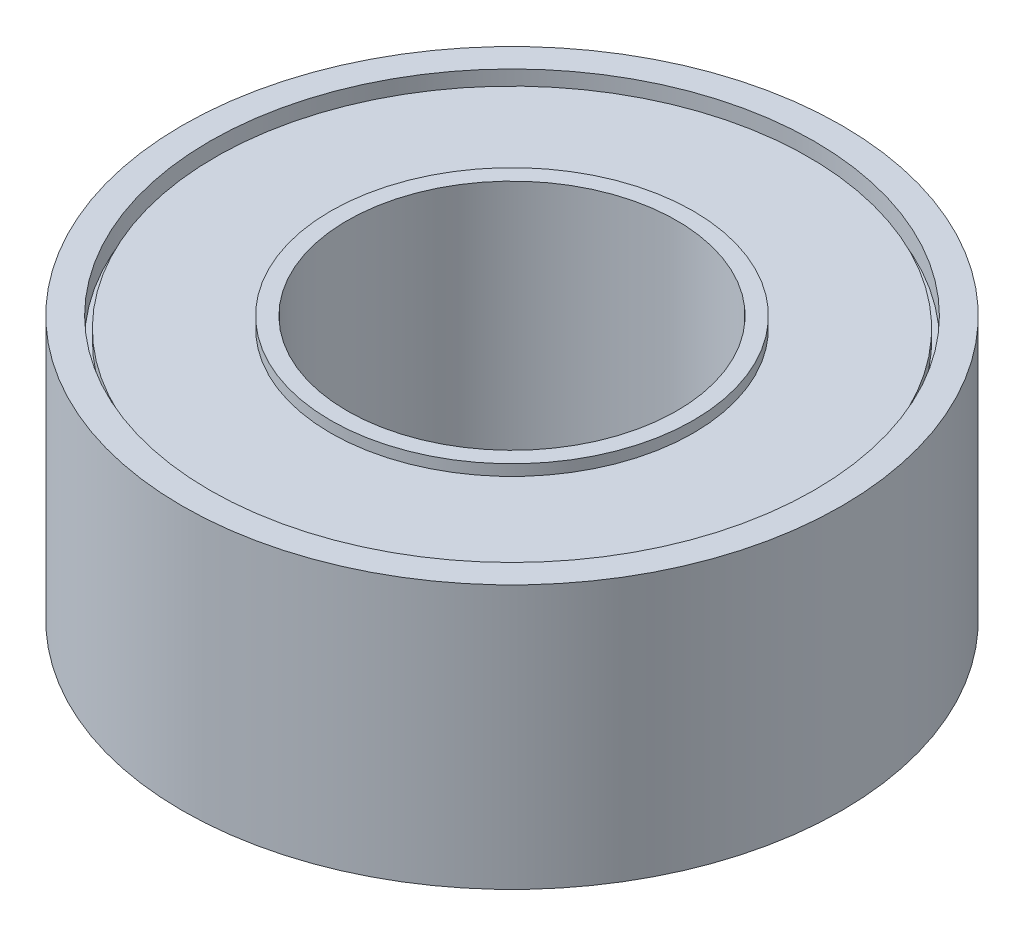
ISO-10303-21;
HEADER;
FILE_DESCRIPTION(('STEP AP214'),'2;1');
FILE_NAME('part.step','',(''),(''),'','','');
FILE_SCHEMA(('AUTOMOTIVE_DESIGN { 1 0 10303 214 1 1 1 1 }'));
ENDSEC;
DATA;
#1=APPLICATION_CONTEXT('core data for automotive mechanical design processes');
#2=APPLICATION_PROTOCOL_DEFINITION('international standard','automotive_design',2000,#1);
#3=PRODUCT_CONTEXT('',#1,'mechanical');
#4=PRODUCT('Part','Part','',(#3));
#5=PRODUCT_RELATED_PRODUCT_CATEGORY('part','',(#4));
#6=PRODUCT_DEFINITION_FORMATION('','',#4);
#7=PRODUCT_DEFINITION_CONTEXT('part definition',#1,'design');
#8=PRODUCT_DEFINITION('design','',#6,#7);
#9=PRODUCT_DEFINITION_SHAPE('','',#8);
#10=(LENGTH_UNIT() NAMED_UNIT(*) SI_UNIT(.MILLI.,.METRE.));
#11=(NAMED_UNIT(*) PLANE_ANGLE_UNIT() SI_UNIT($,.RADIAN.));
#12=(NAMED_UNIT(*) SI_UNIT($,.STERADIAN.) SOLID_ANGLE_UNIT());
#13=UNCERTAINTY_MEASURE_WITH_UNIT(LENGTH_MEASURE(1.E-05),#10,'distance_accuracy_value','');
#14=(GEOMETRIC_REPRESENTATION_CONTEXT(3) GLOBAL_UNCERTAINTY_ASSIGNED_CONTEXT((#13)) GLOBAL_UNIT_ASSIGNED_CONTEXT((#10,
#11,#12)) REPRESENTATION_CONTEXT('',''));
#15=CARTESIAN_POINT('',(0.,0.,0.));
#16=DIRECTION('',(0.,0.,1.));
#17=DIRECTION('',(1.,0.,0.));
#18=AXIS2_PLACEMENT_3D('',#15,#16,#17);
#19=CARTESIAN_POINT('',(0.,2.3,0.));
#20=DIRECTION('',(0.,1.,0.));
#21=DIRECTION('',(0.,0.,1.));
#22=AXIS2_PLACEMENT_3D('',#19,#20,#21);
#23=PLANE('',#22);
#24=CARTESIAN_POINT('',(0.,2.3,0.));
#25=DIRECTION('',(0.,1.,0.));
#26=DIRECTION('',(0.,0.,1.));
#27=AXIS2_PLACEMENT_3D('',#24,#25,#26);
#28=CIRCLE('',#27,1.65);
#29=CARTESIAN_POINT('',(0.,2.3,1.65));
#30=VERTEX_POINT('',#29);
#31=EDGE_CURVE('E53',#30,#30,#28,.T.);
#32=ORIENTED_EDGE('',*,*,#31,.F.);
#33=EDGE_LOOP('',(#32));
#34=FACE_BOUND('',#33,.T.);
#35=CARTESIAN_POINT('',(0.,2.3,0.));
#36=DIRECTION('',(0.,1.,0.));
#37=DIRECTION('',(0.,0.,1.));
#38=AXIS2_PLACEMENT_3D('',#35,#36,#37);
#39=CIRCLE('',#38,2.7);
#40=CARTESIAN_POINT('',(0.,2.3,2.7));
#41=VERTEX_POINT('',#40);
#42=EDGE_CURVE('E81',#41,#41,#39,.T.);
#43=ORIENTED_EDGE('',*,*,#42,.T.);
#44=EDGE_LOOP('',(#43));
#45=FACE_BOUND('',#44,.T.);
#46=ADVANCED_FACE('F32',(#34,#45),#23,.T.);
#47=CARTESIAN_POINT('',(0.,0.1,0.));
#48=DIRECTION('',(0.,-1.,0.));
#49=DIRECTION('',(0.,0.,-1.));
#50=AXIS2_PLACEMENT_3D('',#47,#48,#49);
#51=PLANE('',#50);
#52=CARTESIAN_POINT('',(0.,0.1,0.));
#53=DIRECTION('',(0.,-1.,0.));
#54=DIRECTION('',(0.,0.,-1.));
#55=AXIS2_PLACEMENT_3D('',#52,#53,#54);
#56=CIRCLE('',#55,1.65);
#57=CARTESIAN_POINT('',(0.,0.1,-1.65));
#58=VERTEX_POINT('',#57);
#59=EDGE_CURVE('E62',#58,#58,#56,.T.);
#60=ORIENTED_EDGE('',*,*,#59,.F.);
#61=EDGE_LOOP('',(#60));
#62=FACE_BOUND('',#61,.T.);
#63=CARTESIAN_POINT('',(0.,0.1,0.));
#64=DIRECTION('',(0.,-1.,0.));
#65=DIRECTION('',(0.,0.,-1.));
#66=AXIS2_PLACEMENT_3D('',#63,#64,#65);
#67=CIRCLE('',#66,2.7);
#68=CARTESIAN_POINT('',(0.,0.1,-2.7));
#69=VERTEX_POINT('',#68);
#70=EDGE_CURVE('E72',#69,#69,#67,.T.);
#71=ORIENTED_EDGE('',*,*,#70,.T.);
#72=EDGE_LOOP('',(#71));
#73=FACE_BOUND('',#72,.T.);
#74=ADVANCED_FACE('F114',(#62,#73),#51,.T.);
#75=CARTESIAN_POINT('',(0.,0.,0.));
#76=DIRECTION('',(0.,1.,0.));
#77=DIRECTION('',(0.,0.,1.));
#78=AXIS2_PLACEMENT_3D('',#75,#76,#77);
#79=PLANE('',#78);
#80=CARTESIAN_POINT('',(0.,0.,0.));
#81=DIRECTION('',(0.,1.,0.));
#82=DIRECTION('',(0.,0.,1.));
#83=AXIS2_PLACEMENT_3D('',#80,#81,#82);
#84=CIRCLE('',#83,1.5);
#85=CARTESIAN_POINT('',(0.,0.,1.5));
#86=VERTEX_POINT('',#85);
#87=EDGE_CURVE('E45',#86,#86,#84,.T.);
#88=ORIENTED_EDGE('',*,*,#87,.T.);
#89=EDGE_LOOP('',(#88));
#90=FACE_BOUND('',#89,.T.);
#91=CARTESIAN_POINT('',(0.,0.,0.));
#92=DIRECTION('',(0.,-1.,0.));
#93=DIRECTION('',(0.,0.,-1.));
#94=AXIS2_PLACEMENT_3D('',#91,#92,#93);
#95=CIRCLE('',#94,1.65);
#96=CARTESIAN_POINT('',(0.,0.,-1.65));
#97=VERTEX_POINT('',#96);
#98=EDGE_CURVE('E63',#97,#97,#95,.T.);
#99=ORIENTED_EDGE('',*,*,#98,.T.);
#100=EDGE_LOOP('',(#99));
#101=FACE_BOUND('',#100,.T.);
#102=ADVANCED_FACE('F119',(#90,#101),#79,.F.);
#103=CARTESIAN_POINT('',(0.,2.4,0.));
#104=DIRECTION('',(0.,1.,0.));
#105=DIRECTION('',(0.,0.,1.));
#106=AXIS2_PLACEMENT_3D('',#103,#104,#105);
#107=PLANE('',#106);
#108=CARTESIAN_POINT('',(0.,2.4,0.));
#109=DIRECTION('',(0.,1.,0.));
#110=DIRECTION('',(0.,0.,1.));
#111=AXIS2_PLACEMENT_3D('',#108,#109,#110);
#112=CIRCLE('',#111,1.5);
#113=CARTESIAN_POINT('',(0.,2.4,1.5));
#114=VERTEX_POINT('',#113);
#115=EDGE_CURVE('E43',#114,#114,#112,.T.);
#116=ORIENTED_EDGE('',*,*,#115,.F.);
#117=EDGE_LOOP('',(#116));
#118=FACE_BOUND('',#117,.T.);
#119=CARTESIAN_POINT('',(0.,2.4,0.));
#120=DIRECTION('',(0.,1.,0.));
#121=DIRECTION('',(0.,0.,1.));
#122=AXIS2_PLACEMENT_3D('',#119,#120,#121);
#123=CIRCLE('',#122,1.65);
#124=CARTESIAN_POINT('',(0.,2.4,1.65));
#125=VERTEX_POINT('',#124);
#126=EDGE_CURVE('E54',#125,#125,#123,.T.);
#127=ORIENTED_EDGE('',*,*,#126,.T.);
#128=EDGE_LOOP('',(#127));
#129=FACE_BOUND('',#128,.T.);
#130=ADVANCED_FACE('F183',(#118,#129),#107,.T.);
#131=CARTESIAN_POINT('',(0.,2.4,0.));
#132=DIRECTION('',(0.,1.,0.));
#133=DIRECTION('',(0.,0.,1.));
#134=AXIS2_PLACEMENT_3D('',#131,#132,#133);
#135=CIRCLE('',#134,2.75);
#136=CARTESIAN_POINT('',(0.,2.4,2.75));
#137=VERTEX_POINT('',#136);
#138=EDGE_CURVE('E48',#137,#137,#135,.T.);
#139=ORIENTED_EDGE('',*,*,#138,.F.);
#140=EDGE_LOOP('',(#139));
#141=FACE_BOUND('',#140,.T.);
#142=CARTESIAN_POINT('',(0.,2.4,0.));
#143=DIRECTION('',(0.,1.,0.));
#144=DIRECTION('',(0.,0.,1.));
#145=AXIS2_PLACEMENT_3D('',#142,#143,#144);
#146=CIRCLE('',#145,3.);
#147=CARTESIAN_POINT('',(0.,2.4,3.));
#148=VERTEX_POINT('',#147);
#149=EDGE_CURVE('E10',#148,#148,#146,.T.);
#150=ORIENTED_EDGE('',*,*,#149,.T.);
#151=EDGE_LOOP('',(#150));
#152=FACE_BOUND('',#151,.T.);
#153=ADVANCED_FACE('F176',(#141,#152),#107,.T.);
#154=CARTESIAN_POINT('',(0.,0.,0.));
#155=DIRECTION('',(0.,-1.,0.));
#156=DIRECTION('',(0.,0.,-1.));
#157=AXIS2_PLACEMENT_3D('',#154,#155,#156);
#158=CIRCLE('',#157,2.75);
#159=CARTESIAN_POINT('',(0.,0.,-2.75));
#160=VERTEX_POINT('',#159);
#161=EDGE_CURVE('E57',#160,#160,#158,.T.);
#162=ORIENTED_EDGE('',*,*,#161,.F.);
#163=EDGE_LOOP('',(#162));
#164=FACE_BOUND('',#163,.T.);
#165=CARTESIAN_POINT('',(0.,0.,0.));
#166=DIRECTION('',(0.,1.,0.));
#167=DIRECTION('',(0.,0.,1.));
#168=AXIS2_PLACEMENT_3D('',#165,#166,#167);
#169=CIRCLE('',#168,3.);
#170=CARTESIAN_POINT('',(0.,0.,3.));
#171=VERTEX_POINT('',#170);
#172=EDGE_CURVE('E36',#171,#171,#169,.T.);
#173=ORIENTED_EDGE('',*,*,#172,.F.);
#174=EDGE_LOOP('',(#173));
#175=FACE_BOUND('',#174,.T.);
#176=ADVANCED_FACE('F185',(#164,#175),#79,.F.);
#177=CARTESIAN_POINT('',(0.,2.4,0.));
#178=DIRECTION('',(0.,-1.,0.));
#179=DIRECTION('',(0.,0.,-1.));
#180=AXIS2_PLACEMENT_3D('',#177,#178,#179);
#181=CYLINDRICAL_SURFACE('',#180,3.);
#182=ORIENTED_EDGE('',*,*,#149,.F.);
#183=EDGE_LOOP('',(#182));
#184=FACE_BOUND('',#183,.T.);
#185=ORIENTED_EDGE('',*,*,#172,.T.);
#186=EDGE_LOOP('',(#185));
#187=FACE_BOUND('',#186,.T.);
#188=ADVANCED_FACE('F34',(#184,#187),#181,.T.);
#189=CARTESIAN_POINT('',(0.,2.4,0.));
#190=DIRECTION('',(0.,-1.,0.));
#191=DIRECTION('',(0.,0.,-1.));
#192=AXIS2_PLACEMENT_3D('',#189,#190,#191);
#193=CYLINDRICAL_SURFACE('',#192,1.5);
#194=ORIENTED_EDGE('',*,*,#115,.T.);
#195=EDGE_LOOP('',(#194));
#196=FACE_BOUND('',#195,.T.);
#197=ORIENTED_EDGE('',*,*,#87,.F.);
#198=EDGE_LOOP('',(#197));
#199=FACE_BOUND('',#198,.T.);
#200=ADVANCED_FACE('F100',(#196,#199),#193,.F.);
#201=CARTESIAN_POINT('',(0.,2.3,0.));
#202=DIRECTION('',(0.,1.,0.));
#203=DIRECTION('',(0.,0.,1.));
#204=AXIS2_PLACEMENT_3D('',#201,#202,#203);
#205=CYLINDRICAL_SURFACE('',#204,2.75);
#206=ORIENTED_EDGE('',*,*,#138,.T.);
#207=EDGE_LOOP('',(#206));
#208=FACE_BOUND('',#207,.T.);
#209=CARTESIAN_POINT('',(0.,2.2,0.));
#210=DIRECTION('',(0.,1.,0.));
#211=DIRECTION('',(0.,0.,1.));
#212=AXIS2_PLACEMENT_3D('',#209,#210,#211);
#213=CIRCLE('',#212,2.75);
#214=CARTESIAN_POINT('',(0.,2.2,2.75));
#215=VERTEX_POINT('',#214);
#216=EDGE_CURVE('E75',#215,#215,#213,.T.);
#217=ORIENTED_EDGE('',*,*,#216,.F.);
#218=EDGE_LOOP('',(#217));
#219=FACE_BOUND('',#218,.T.);
#220=ADVANCED_FACE('F97',(#208,#219),#205,.F.);
#221=CARTESIAN_POINT('',(0.,2.3,0.));
#222=DIRECTION('',(0.,1.,0.));
#223=DIRECTION('',(0.,0.,1.));
#224=AXIS2_PLACEMENT_3D('',#221,#222,#223);
#225=CYLINDRICAL_SURFACE('',#224,1.65);
#226=ORIENTED_EDGE('',*,*,#31,.T.);
#227=EDGE_LOOP('',(#226));
#228=FACE_BOUND('',#227,.T.);
#229=ORIENTED_EDGE('',*,*,#126,.F.);
#230=EDGE_LOOP('',(#229));
#231=FACE_BOUND('',#230,.T.);
#232=ADVANCED_FACE('F99',(#228,#231),#225,.T.);
#233=CARTESIAN_POINT('',(0.,0.1,0.));
#234=DIRECTION('',(0.,-1.,0.));
#235=DIRECTION('',(0.,0.,-1.));
#236=AXIS2_PLACEMENT_3D('',#233,#234,#235);
#237=CYLINDRICAL_SURFACE('',#236,2.75);
#238=ORIENTED_EDGE('',*,*,#161,.T.);
#239=EDGE_LOOP('',(#238));
#240=FACE_BOUND('',#239,.T.);
#241=CARTESIAN_POINT('',(0.,0.2,0.));
#242=DIRECTION('',(0.,-1.,0.));
#243=DIRECTION('',(0.,0.,-1.));
#244=AXIS2_PLACEMENT_3D('',#241,#242,#243);
#245=CIRCLE('',#244,2.75);
#246=CARTESIAN_POINT('',(0.,0.2,-2.75));
#247=VERTEX_POINT('',#246);
#248=EDGE_CURVE('E66',#247,#247,#245,.T.);
#249=ORIENTED_EDGE('',*,*,#248,.F.);
#250=EDGE_LOOP('',(#249));
#251=FACE_BOUND('',#250,.T.);
#252=ADVANCED_FACE('F107',(#240,#251),#237,.F.);
#253=CARTESIAN_POINT('',(0.,0.1,0.));
#254=DIRECTION('',(0.,-1.,0.));
#255=DIRECTION('',(0.,0.,-1.));
#256=AXIS2_PLACEMENT_3D('',#253,#254,#255);
#257=CYLINDRICAL_SURFACE('',#256,1.65);
#258=ORIENTED_EDGE('',*,*,#59,.T.);
#259=EDGE_LOOP('',(#258));
#260=FACE_BOUND('',#259,.T.);
#261=ORIENTED_EDGE('',*,*,#98,.F.);
#262=EDGE_LOOP('',(#261));
#263=FACE_BOUND('',#262,.T.);
#264=ADVANCED_FACE('F126',(#260,#263),#257,.T.);
#265=CARTESIAN_POINT('',(0.,0.2,0.));
#266=DIRECTION('',(0.,-1.,0.));
#267=DIRECTION('',(0.,0.,-1.));
#268=AXIS2_PLACEMENT_3D('',#265,#266,#267);
#269=PLANE('',#268);
#270=CARTESIAN_POINT('',(0.,0.2,0.));
#271=DIRECTION('',(0.,-1.,0.));
#272=DIRECTION('',(0.,0.,-1.));
#273=AXIS2_PLACEMENT_3D('',#270,#271,#272);
#274=CIRCLE('',#273,2.7);
#275=CARTESIAN_POINT('',(0.,0.2,-2.7));
#276=VERTEX_POINT('',#275);
#277=EDGE_CURVE('E71',#276,#276,#274,.T.);
#278=ORIENTED_EDGE('',*,*,#277,.F.);
#279=EDGE_LOOP('',(#278));
#280=FACE_BOUND('',#279,.T.);
#281=ORIENTED_EDGE('',*,*,#248,.T.);
#282=EDGE_LOOP('',(#281));
#283=FACE_BOUND('',#282,.T.);
#284=ADVANCED_FACE('F131',(#280,#283),#269,.T.);
#285=CARTESIAN_POINT('',(0.,0.2,0.));
#286=DIRECTION('',(0.,-1.,0.));
#287=DIRECTION('',(0.,0.,-1.));
#288=AXIS2_PLACEMENT_3D('',#285,#286,#287);
#289=CYLINDRICAL_SURFACE('',#288,2.7);
#290=ORIENTED_EDGE('',*,*,#277,.T.);
#291=EDGE_LOOP('',(#290));
#292=FACE_BOUND('',#291,.T.);
#293=ORIENTED_EDGE('',*,*,#70,.F.);
#294=EDGE_LOOP('',(#293));
#295=FACE_BOUND('',#294,.T.);
#296=ADVANCED_FACE('F93',(#292,#295),#289,.T.);
#297=CARTESIAN_POINT('',(0.,2.2,0.));
#298=DIRECTION('',(0.,1.,0.));
#299=DIRECTION('',(0.,0.,1.));
#300=AXIS2_PLACEMENT_3D('',#297,#298,#299);
#301=PLANE('',#300);
#302=CARTESIAN_POINT('',(0.,2.2,0.));
#303=DIRECTION('',(0.,1.,0.));
#304=DIRECTION('',(0.,0.,1.));
#305=AXIS2_PLACEMENT_3D('',#302,#303,#304);
#306=CIRCLE('',#305,2.7);
#307=CARTESIAN_POINT('',(0.,2.2,2.7));
#308=VERTEX_POINT('',#307);
#309=EDGE_CURVE('E80',#308,#308,#306,.T.);
#310=ORIENTED_EDGE('',*,*,#309,.F.);
#311=EDGE_LOOP('',(#310));
#312=FACE_BOUND('',#311,.T.);
#313=ORIENTED_EDGE('',*,*,#216,.T.);
#314=EDGE_LOOP('',(#313));
#315=FACE_BOUND('',#314,.T.);
#316=ADVANCED_FACE('F90',(#312,#315),#301,.T.);
#317=CARTESIAN_POINT('',(0.,2.2,0.));
#318=DIRECTION('',(0.,1.,0.));
#319=DIRECTION('',(0.,0.,1.));
#320=AXIS2_PLACEMENT_3D('',#317,#318,#319);
#321=CYLINDRICAL_SURFACE('',#320,2.7);
#322=ORIENTED_EDGE('',*,*,#309,.T.);
#323=EDGE_LOOP('',(#322));
#324=FACE_BOUND('',#323,.T.);
#325=ORIENTED_EDGE('',*,*,#42,.F.);
#326=EDGE_LOOP('',(#325));
#327=FACE_BOUND('',#326,.T.);
#328=ADVANCED_FACE('F87',(#324,#327),#321,.T.);
#329=CLOSED_SHELL('',(#46,#74,#102,#130,#153,#176,#188,#200,#220,#232,#252,#264,#284,#296,#316,#328));
#330=MANIFOLD_SOLID_BREP('B2',#329);
#331=ADVANCED_BREP_SHAPE_REPRESENTATION('',(#18,#330),#14);
#332=SHAPE_DEFINITION_REPRESENTATION(#9,#331);
ENDSEC;
END-ISO-10303-21;
